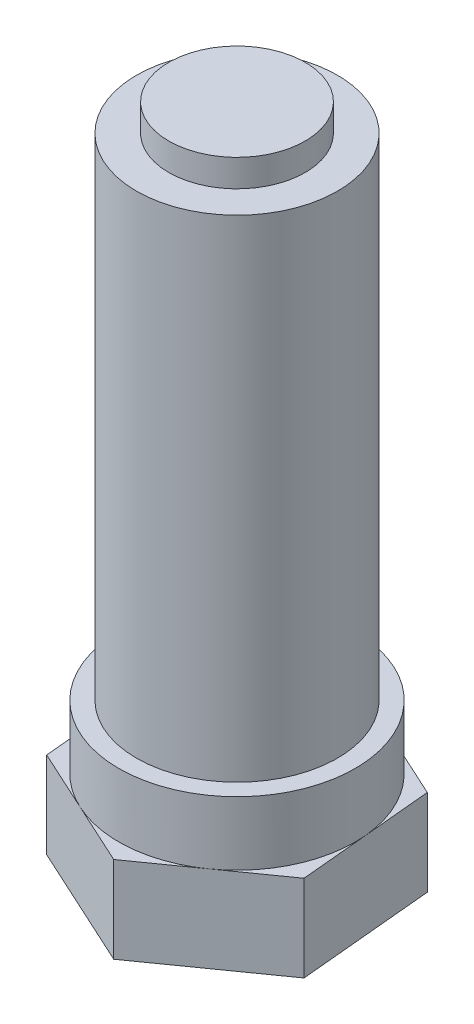
ISO-10303-21;
HEADER;
FILE_DESCRIPTION(('STEP AP214'),'2;1');
FILE_NAME('part.step','',(''),(''),'','','');
FILE_SCHEMA(('AUTOMOTIVE_DESIGN { 1 0 10303 214 1 1 1 1 }'));
ENDSEC;
DATA;
#1=APPLICATION_CONTEXT('core data for automotive mechanical design processes');
#2=APPLICATION_PROTOCOL_DEFINITION('international standard','automotive_design',2000,#1);
#3=PRODUCT_CONTEXT('',#1,'mechanical');
#4=PRODUCT('Part','Part','',(#3));
#5=PRODUCT_RELATED_PRODUCT_CATEGORY('part','',(#4));
#6=PRODUCT_DEFINITION_FORMATION('','',#4);
#7=PRODUCT_DEFINITION_CONTEXT('part definition',#1,'design');
#8=PRODUCT_DEFINITION('design','',#6,#7);
#9=PRODUCT_DEFINITION_SHAPE('','',#8);
#10=(LENGTH_UNIT() NAMED_UNIT(*) SI_UNIT(.MILLI.,.METRE.));
#11=(NAMED_UNIT(*) PLANE_ANGLE_UNIT() SI_UNIT($,.RADIAN.));
#12=(NAMED_UNIT(*) SI_UNIT($,.STERADIAN.) SOLID_ANGLE_UNIT());
#13=UNCERTAINTY_MEASURE_WITH_UNIT(LENGTH_MEASURE(1.E-05),#10,'distance_accuracy_value','');
#14=(GEOMETRIC_REPRESENTATION_CONTEXT(3) GLOBAL_UNCERTAINTY_ASSIGNED_CONTEXT((#13)) GLOBAL_UNIT_ASSIGNED_CONTEXT((#10,
#11,#12)) REPRESENTATION_CONTEXT('',''));
#15=CARTESIAN_POINT('',(0.,0.,0.));
#16=DIRECTION('',(0.,0.,1.));
#17=DIRECTION('',(1.,0.,0.));
#18=AXIS2_PLACEMENT_3D('',#15,#16,#17);
#19=CARTESIAN_POINT('',(0.,9.5,0.));
#20=DIRECTION('',(0.,1.,0.));
#21=DIRECTION('',(0.,0.,1.));
#22=AXIS2_PLACEMENT_3D('',#19,#20,#21);
#23=PLANE('',#22);
#24=CARTESIAN_POINT('',(0.,9.5,0.));
#25=DIRECTION('',(0.,1.,0.));
#26=DIRECTION('',(0.,0.,1.));
#27=AXIS2_PLACEMENT_3D('',#24,#25,#26);
#28=CIRCLE('',#27,13.);
#29=CARTESIAN_POINT('',(7.51506732107869,9.5,10.6077218647387));
#30=VERTEX_POINT('',#29);
#31=CARTESIAN_POINT('',(12.9440902716827,9.5,-1.20437827883507));
#32=VERTEX_POINT('',#31);
#33=EDGE_CURVE('E134',#30,#32,#28,.T.);
#34=ORIENTED_EDGE('',*,*,#33,.F.);
#35=DIRECTION('',(0.815978604979899,0.,-0.578082101621438));
#36=VECTOR('',#35,1.);
#37=CARTESIAN_POINT('',(1.39069624698313,9.5,14.9465480055416));
#38=LINE('',#37,#36);
#39=CARTESIAN_POINT('',(13.6394383951743,9.5,6.26889572393574));
#40=VERTEX_POINT('',#39);
#41=EDGE_CURVE('E123',#30,#40,#38,.T.);
#42=ORIENTED_EDGE('',*,*,#41,.T.);
#43=DIRECTION('',(-0.0926444829873134,0.,-0.995699251667899));
#44=VECTOR('',#43,1.);
#45=CARTESIAN_POINT('',(13.6394383951743,9.5,6.26889572393574));
#46=LINE('',#45,#44);
#47=EDGE_CURVE('E135',#40,#32,#46,.T.);
#48=ORIENTED_EDGE('',*,*,#47,.T.);
#49=EDGE_LOOP('',(#34,#42,#48));
#50=FACE_BOUND('',#49,.T.);
#51=ADVANCED_FACE('F43',(#50),#23,.T.);
#52=CARTESIAN_POINT('',(5.42902295060399,9.5,-11.8121001435738));
#53=VERTEX_POINT('',#52);
#54=EDGE_CURVE('E141',#32,#53,#28,.T.);
#55=ORIENTED_EDGE('',*,*,#54,.F.);
#56=CARTESIAN_POINT('',(12.2487421481911,9.5,-8.67765228160589));
#57=VERTEX_POINT('',#56);
#58=EDGE_CURVE('E122',#32,#57,#46,.T.);
#59=ORIENTED_EDGE('',*,*,#58,.T.);
#60=DIRECTION('',(-0.908623087967212,0.,-0.417617150046461));
#61=VECTOR('',#60,1.);
#62=CARTESIAN_POINT('',(12.2487421481911,9.5,-8.67765228160589));
#63=LINE('',#62,#61);
#64=EDGE_CURVE('E151',#57,#53,#63,.T.);
#65=ORIENTED_EDGE('',*,*,#64,.T.);
#66=EDGE_LOOP('',(#55,#59,#65));
#67=FACE_BOUND('',#66,.T.);
#68=ADVANCED_FACE('F248',(#67),#23,.T.);
#69=CARTESIAN_POINT('',(-7.51506732107869,9.5,-10.6077218647387));
#70=VERTEX_POINT('',#69);
#71=EDGE_CURVE('E213',#53,#70,#28,.T.);
#72=ORIENTED_EDGE('',*,*,#71,.F.);
#73=CARTESIAN_POINT('',(-1.39069624698313,9.5,-14.9465480055416));
#74=VERTEX_POINT('',#73);
#75=EDGE_CURVE('E150',#53,#74,#63,.T.);
#76=ORIENTED_EDGE('',*,*,#75,.T.);
#77=DIRECTION('',(-0.815978604979899,0.,0.578082101621438));
#78=VECTOR('',#77,1.);
#79=CARTESIAN_POINT('',(-1.39069624698313,9.5,-14.9465480055416));
#80=LINE('',#79,#78);
#81=EDGE_CURVE('E155',#74,#70,#80,.T.);
#82=ORIENTED_EDGE('',*,*,#81,.T.);
#83=EDGE_LOOP('',(#72,#76,#82));
#84=FACE_BOUND('',#83,.T.);
#85=ADVANCED_FACE('F254',(#84),#23,.T.);
#86=CARTESIAN_POINT('',(-12.9440902716827,9.5,1.20437827883507));
#87=VERTEX_POINT('',#86);
#88=EDGE_CURVE('E144',#70,#87,#28,.T.);
#89=ORIENTED_EDGE('',*,*,#88,.F.);
#90=CARTESIAN_POINT('',(-13.6394383951743,9.5,-6.26889572393574));
#91=VERTEX_POINT('',#90);
#92=EDGE_CURVE('E154',#70,#91,#80,.T.);
#93=ORIENTED_EDGE('',*,*,#92,.T.);
#94=DIRECTION('',(0.0926444829873133,0.,0.995699251667899));
#95=VECTOR('',#94,1.);
#96=CARTESIAN_POINT('',(-13.6394383951743,9.5,-6.26889572393574));
#97=LINE('',#96,#95);
#98=EDGE_CURVE('E159',#91,#87,#97,.T.);
#99=ORIENTED_EDGE('',*,*,#98,.T.);
#100=EDGE_LOOP('',(#89,#93,#99));
#101=FACE_BOUND('',#100,.T.);
#102=ADVANCED_FACE('F211',(#101),#23,.T.);
#103=CARTESIAN_POINT('',(-5.42902295060399,9.5,11.8121001435738));
#104=VERTEX_POINT('',#103);
#105=EDGE_CURVE('E68',#87,#104,#28,.T.);
#106=ORIENTED_EDGE('',*,*,#105,.F.);
#107=CARTESIAN_POINT('',(-12.2487421481911,9.5,8.67765228160589));
#108=VERTEX_POINT('',#107);
#109=EDGE_CURVE('E158',#87,#108,#97,.T.);
#110=ORIENTED_EDGE('',*,*,#109,.T.);
#111=DIRECTION('',(0.908623087967212,0.,0.417617150046461));
#112=VECTOR('',#111,1.);
#113=CARTESIAN_POINT('',(-12.2487421481911,9.5,8.67765228160589));
#114=LINE('',#113,#112);
#115=EDGE_CURVE('E162',#108,#104,#114,.T.);
#116=ORIENTED_EDGE('',*,*,#115,.T.);
#117=EDGE_LOOP('',(#106,#110,#116));
#118=FACE_BOUND('',#117,.T.);
#119=ADVANCED_FACE('F260',(#118),#23,.T.);
#120=CARTESIAN_POINT('',(1.39069624698313,9.5,14.9465480055416));
#121=DIRECTION('',(-0.578082101621438,0.,-0.815978604979899));
#122=DIRECTION('',(-0.815978604979899,0.,0.578082101621438));
#123=AXIS2_PLACEMENT_3D('',#120,#121,#122);
#124=PLANE('',#123);
#125=DIRECTION('',(0.815978604979899,0.,-0.578082101621438));
#126=VECTOR('',#125,1.);
#127=CARTESIAN_POINT('',(1.39069624698313,0.,14.9465480055416));
#128=LINE('',#127,#126);
#129=CARTESIAN_POINT('',(1.39069624698313,0.,14.9465480055416));
#130=VERTEX_POINT('',#129);
#131=CARTESIAN_POINT('',(13.6394383951743,0.,6.26889572393574));
#132=VERTEX_POINT('',#131);
#133=EDGE_CURVE('E165',#130,#132,#128,.T.);
#134=ORIENTED_EDGE('',*,*,#133,.T.);
#135=DIRECTION('',(0.,-1.,0.));
#136=VECTOR('',#135,1.);
#137=CARTESIAN_POINT('',(13.6394383951743,9.5,6.26889572393574));
#138=LINE('',#137,#136);
#139=EDGE_CURVE('E47',#40,#132,#138,.T.);
#140=ORIENTED_EDGE('',*,*,#139,.F.);
#141=ORIENTED_EDGE('',*,*,#41,.F.);
#142=CARTESIAN_POINT('',(1.39069624698313,9.5,14.9465480055416));
#143=VERTEX_POINT('',#142);
#144=EDGE_CURVE('E115',#143,#30,#38,.T.);
#145=ORIENTED_EDGE('',*,*,#144,.F.);
#146=DIRECTION('',(0.,-1.,0.));
#147=VECTOR('',#146,1.);
#148=CARTESIAN_POINT('',(1.39069624698313,9.5,14.9465480055416));
#149=LINE('',#148,#147);
#150=EDGE_CURVE('E164',#143,#130,#149,.T.);
#151=ORIENTED_EDGE('',*,*,#150,.T.);
#152=EDGE_LOOP('',(#134,#140,#141,#145,#151));
#153=FACE_BOUND('',#152,.T.);
#154=ADVANCED_FACE('F45',(#153),#124,.F.);
#155=CARTESIAN_POINT('',(13.6394383951743,9.5,6.26889572393574));
#156=DIRECTION('',(-0.995699251667899,0.,0.0926444829873133));
#157=DIRECTION('',(0.0926444829873133,0.,0.995699251667899));
#158=AXIS2_PLACEMENT_3D('',#155,#156,#157);
#159=PLANE('',#158);
#160=DIRECTION('',(-0.0926444829873134,0.,-0.995699251667899));
#161=VECTOR('',#160,1.);
#162=CARTESIAN_POINT('',(13.6394383951743,0.,6.26889572393574));
#163=LINE('',#162,#161);
#164=CARTESIAN_POINT('',(12.2487421481911,0.,-8.67765228160589));
#165=VERTEX_POINT('',#164);
#166=EDGE_CURVE('E167',#132,#165,#163,.T.);
#167=ORIENTED_EDGE('',*,*,#166,.T.);
#168=DIRECTION('',(0.,-1.,0.));
#169=VECTOR('',#168,1.);
#170=CARTESIAN_POINT('',(12.2487421481911,9.5,-8.67765228160589));
#171=LINE('',#170,#169);
#172=EDGE_CURVE('E145',#57,#165,#171,.T.);
#173=ORIENTED_EDGE('',*,*,#172,.F.);
#174=ORIENTED_EDGE('',*,*,#58,.F.);
#175=ORIENTED_EDGE('',*,*,#47,.F.);
#176=ORIENTED_EDGE('',*,*,#139,.T.);
#177=EDGE_LOOP('',(#167,#173,#174,#175,#176));
#178=FACE_BOUND('',#177,.T.);
#179=ADVANCED_FACE('F272',(#178),#159,.F.);
#180=CARTESIAN_POINT('',(12.2487421481911,9.5,-8.67765228160589));
#181=DIRECTION('',(-0.417617150046461,0.,0.908623087967212));
#182=DIRECTION('',(0.908623087967212,0.,0.417617150046461));
#183=AXIS2_PLACEMENT_3D('',#180,#181,#182);
#184=PLANE('',#183);
#185=DIRECTION('',(-0.908623087967212,0.,-0.417617150046461));
#186=VECTOR('',#185,1.);
#187=CARTESIAN_POINT('',(12.2487421481911,0.,-8.67765228160589));
#188=LINE('',#187,#186);
#189=CARTESIAN_POINT('',(-1.39069624698313,0.,-14.9465480055416));
#190=VERTEX_POINT('',#189);
#191=EDGE_CURVE('E169',#165,#190,#188,.T.);
#192=ORIENTED_EDGE('',*,*,#191,.T.);
#193=DIRECTION('',(0.,-1.,0.));
#194=VECTOR('',#193,1.);
#195=CARTESIAN_POINT('',(-1.39069624698313,9.5,-14.9465480055416));
#196=LINE('',#195,#194);
#197=EDGE_CURVE('E183',#74,#190,#196,.T.);
#198=ORIENTED_EDGE('',*,*,#197,.F.);
#199=ORIENTED_EDGE('',*,*,#75,.F.);
#200=ORIENTED_EDGE('',*,*,#64,.F.);
#201=ORIENTED_EDGE('',*,*,#172,.T.);
#202=EDGE_LOOP('',(#192,#198,#199,#200,#201));
#203=FACE_BOUND('',#202,.T.);
#204=ADVANCED_FACE('F190',(#203),#184,.F.);
#205=CARTESIAN_POINT('',(-1.39069624698313,9.5,-14.9465480055416));
#206=DIRECTION('',(0.578082101621438,0.,0.815978604979899));
#207=DIRECTION('',(0.815978604979899,0.,-0.578082101621438));
#208=AXIS2_PLACEMENT_3D('',#205,#206,#207);
#209=PLANE('',#208);
#210=DIRECTION('',(-0.815978604979899,0.,0.578082101621438));
#211=VECTOR('',#210,1.);
#212=CARTESIAN_POINT('',(-1.39069624698313,0.,-14.9465480055416));
#213=LINE('',#212,#211);
#214=CARTESIAN_POINT('',(-13.6394383951743,0.,-6.26889572393574));
#215=VERTEX_POINT('',#214);
#216=EDGE_CURVE('E171',#190,#215,#213,.T.);
#217=ORIENTED_EDGE('',*,*,#216,.T.);
#218=DIRECTION('',(0.,-1.,0.));
#219=VECTOR('',#218,1.);
#220=CARTESIAN_POINT('',(-13.6394383951743,9.5,-6.26889572393574));
#221=LINE('',#220,#219);
#222=EDGE_CURVE('E180',#91,#215,#221,.T.);
#223=ORIENTED_EDGE('',*,*,#222,.F.);
#224=ORIENTED_EDGE('',*,*,#92,.F.);
#225=ORIENTED_EDGE('',*,*,#81,.F.);
#226=ORIENTED_EDGE('',*,*,#197,.T.);
#227=EDGE_LOOP('',(#217,#223,#224,#225,#226));
#228=FACE_BOUND('',#227,.T.);
#229=ADVANCED_FACE('F203',(#228),#209,.F.);
#230=CARTESIAN_POINT('',(-13.6394383951743,9.5,-6.26889572393574));
#231=DIRECTION('',(0.995699251667899,0.,-0.0926444829873132));
#232=DIRECTION('',(-0.0926444829873132,0.,-0.995699251667899));
#233=AXIS2_PLACEMENT_3D('',#230,#231,#232);
#234=PLANE('',#233);
#235=DIRECTION('',(0.0926444829873133,0.,0.995699251667899));
#236=VECTOR('',#235,1.);
#237=CARTESIAN_POINT('',(-13.6394383951743,0.,-6.26889572393574));
#238=LINE('',#237,#236);
#239=CARTESIAN_POINT('',(-12.2487421481911,0.,8.67765228160589));
#240=VERTEX_POINT('',#239);
#241=EDGE_CURVE('E173',#215,#240,#238,.T.);
#242=ORIENTED_EDGE('',*,*,#241,.T.);
#243=DIRECTION('',(0.,-1.,0.));
#244=VECTOR('',#243,1.);
#245=CARTESIAN_POINT('',(-12.2487421481911,9.5,8.67765228160589));
#246=LINE('',#245,#244);
#247=EDGE_CURVE('E177',#108,#240,#246,.T.);
#248=ORIENTED_EDGE('',*,*,#247,.F.);
#249=ORIENTED_EDGE('',*,*,#109,.F.);
#250=ORIENTED_EDGE('',*,*,#98,.F.);
#251=ORIENTED_EDGE('',*,*,#222,.T.);
#252=EDGE_LOOP('',(#242,#248,#249,#250,#251));
#253=FACE_BOUND('',#252,.T.);
#254=ADVANCED_FACE('F208',(#253),#234,.F.);
#255=CARTESIAN_POINT('',(-12.2487421481911,9.5,8.67765228160589));
#256=DIRECTION('',(0.417617150046461,0.,-0.908623087967212));
#257=DIRECTION('',(-0.908623087967212,0.,-0.417617150046461));
#258=AXIS2_PLACEMENT_3D('',#255,#256,#257);
#259=PLANE('',#258);
#260=DIRECTION('',(0.908623087967212,0.,0.417617150046461));
#261=VECTOR('',#260,1.);
#262=CARTESIAN_POINT('',(-12.2487421481911,0.,8.67765228160589));
#263=LINE('',#262,#261);
#264=EDGE_CURVE('E132',#240,#130,#263,.T.);
#265=ORIENTED_EDGE('',*,*,#264,.T.);
#266=ORIENTED_EDGE('',*,*,#150,.F.);
#267=EDGE_CURVE('E118',#104,#143,#114,.T.);
#268=ORIENTED_EDGE('',*,*,#267,.F.);
#269=ORIENTED_EDGE('',*,*,#115,.F.);
#270=ORIENTED_EDGE('',*,*,#247,.T.);
#271=EDGE_LOOP('',(#265,#266,#268,#269,#270));
#272=FACE_BOUND('',#271,.T.);
#273=ADVANCED_FACE('F259',(#272),#259,.F.);
#274=EDGE_CURVE('E60',#104,#30,#28,.T.);
#275=ORIENTED_EDGE('',*,*,#274,.F.);
#276=ORIENTED_EDGE('',*,*,#267,.T.);
#277=ORIENTED_EDGE('',*,*,#144,.T.);
#278=EDGE_LOOP('',(#275,#276,#277));
#279=FACE_BOUND('',#278,.T.);
#280=ADVANCED_FACE('F117',(#279),#23,.T.);
#281=CARTESIAN_POINT('',(0.,0.,0.));
#282=DIRECTION('',(0.,1.,0.));
#283=DIRECTION('',(0.,0.,1.));
#284=AXIS2_PLACEMENT_3D('',#281,#282,#283);
#285=PLANE('',#284);
#286=ORIENTED_EDGE('',*,*,#133,.F.);
#287=ORIENTED_EDGE('',*,*,#264,.F.);
#288=ORIENTED_EDGE('',*,*,#241,.F.);
#289=ORIENTED_EDGE('',*,*,#216,.F.);
#290=ORIENTED_EDGE('',*,*,#191,.F.);
#291=ORIENTED_EDGE('',*,*,#166,.F.);
#292=EDGE_LOOP('',(#286,#287,#288,#289,#290,#291));
#293=FACE_BOUND('',#292,.T.);
#294=ADVANCED_FACE('F198',(#293),#285,.F.);
#295=CARTESIAN_POINT('',(0.,16.5,0.));
#296=DIRECTION('',(0.,-1.,0.));
#297=DIRECTION('',(0.,0.,-1.));
#298=AXIS2_PLACEMENT_3D('',#295,#296,#297);
#299=CYLINDRICAL_SURFACE('',#298,13.);
#300=CARTESIAN_POINT('',(0.,16.5,0.));
#301=DIRECTION('',(0.,1.,0.));
#302=DIRECTION('',(0.,0.,1.));
#303=AXIS2_PLACEMENT_3D('',#300,#301,#302);
#304=CIRCLE('',#303,13.);
#305=CARTESIAN_POINT('',(0.,16.5,13.));
#306=VERTEX_POINT('',#305);
#307=EDGE_CURVE('E138',#306,#306,#304,.T.);
#308=ORIENTED_EDGE('',*,*,#307,.F.);
#309=EDGE_LOOP('',(#308));
#310=FACE_BOUND('',#309,.T.);
#311=ORIENTED_EDGE('',*,*,#33,.T.);
#312=ORIENTED_EDGE('',*,*,#54,.T.);
#313=ORIENTED_EDGE('',*,*,#71,.T.);
#314=ORIENTED_EDGE('',*,*,#88,.T.);
#315=ORIENTED_EDGE('',*,*,#105,.T.);
#316=ORIENTED_EDGE('',*,*,#274,.T.);
#317=EDGE_LOOP('',(#311,#312,#313,#314,#315,#316));
#318=FACE_BOUND('',#317,.T.);
#319=ADVANCED_FACE('F142',(#310,#318),#299,.T.);
#320=CARTESIAN_POINT('',(0.,16.5,0.));
#321=DIRECTION('',(0.,1.,0.));
#322=DIRECTION('',(0.,0.,1.));
#323=AXIS2_PLACEMENT_3D('',#320,#321,#322);
#324=PLANE('',#323);
#325=CARTESIAN_POINT('',(0.,16.5,0.));
#326=DIRECTION('',(0.,1.,0.));
#327=DIRECTION('',(0.,0.,1.));
#328=AXIS2_PLACEMENT_3D('',#325,#326,#327);
#329=CIRCLE('',#328,11.05);
#330=CARTESIAN_POINT('',(0.,16.5,11.05));
#331=VERTEX_POINT('',#330);
#332=EDGE_CURVE('E52',#331,#331,#329,.T.);
#333=ORIENTED_EDGE('',*,*,#332,.F.);
#334=EDGE_LOOP('',(#333));
#335=FACE_BOUND('',#334,.T.);
#336=ORIENTED_EDGE('',*,*,#307,.T.);
#337=EDGE_LOOP('',(#336));
#338=FACE_BOUND('',#337,.T.);
#339=ADVANCED_FACE('F240',(#335,#338),#324,.T.);
#340=CARTESIAN_POINT('',(0.,70.5,0.));
#341=DIRECTION('',(0.,-1.,0.));
#342=DIRECTION('',(0.,0.,-1.));
#343=AXIS2_PLACEMENT_3D('',#340,#341,#342);
#344=CYLINDRICAL_SURFACE('',#343,11.05);
#345=CARTESIAN_POINT('',(0.,70.5,0.));
#346=DIRECTION('',(0.,1.,0.));
#347=DIRECTION('',(0.,0.,1.));
#348=AXIS2_PLACEMENT_3D('',#345,#346,#347);
#349=CIRCLE('',#348,11.05);
#350=CARTESIAN_POINT('',(0.,70.5,11.05));
#351=VERTEX_POINT('',#350);
#352=EDGE_CURVE('E139',#351,#351,#349,.T.);
#353=ORIENTED_EDGE('',*,*,#352,.F.);
#354=EDGE_LOOP('',(#353));
#355=FACE_BOUND('',#354,.T.);
#356=ORIENTED_EDGE('',*,*,#332,.T.);
#357=EDGE_LOOP('',(#356));
#358=FACE_BOUND('',#357,.T.);
#359=ADVANCED_FACE('F235',(#355,#358),#344,.T.);
#360=CARTESIAN_POINT('',(0.,70.5,0.));
#361=DIRECTION('',(0.,1.,0.));
#362=DIRECTION('',(0.,0.,1.));
#363=AXIS2_PLACEMENT_3D('',#360,#361,#362);
#364=PLANE('',#363);
#365=CARTESIAN_POINT('',(0.,70.5,0.));
#366=DIRECTION('',(0.,1.,0.));
#367=DIRECTION('',(0.,0.,1.));
#368=AXIS2_PLACEMENT_3D('',#365,#366,#367);
#369=CIRCLE('',#368,7.5);
#370=CARTESIAN_POINT('',(0.,70.5,7.5));
#371=VERTEX_POINT('',#370);
#372=EDGE_CURVE('E11',#371,#371,#369,.T.);
#373=ORIENTED_EDGE('',*,*,#372,.F.);
#374=EDGE_LOOP('',(#373));
#375=FACE_BOUND('',#374,.T.);
#376=ORIENTED_EDGE('',*,*,#352,.T.);
#377=EDGE_LOOP('',(#376));
#378=FACE_BOUND('',#377,.T.);
#379=ADVANCED_FACE('F229',(#375,#378),#364,.T.);
#380=CARTESIAN_POINT('',(0.,73.5,0.));
#381=DIRECTION('',(0.,-1.,0.));
#382=DIRECTION('',(0.,0.,-1.));
#383=AXIS2_PLACEMENT_3D('',#380,#381,#382);
#384=CYLINDRICAL_SURFACE('',#383,7.5);
#385=CARTESIAN_POINT('',(0.,73.5,0.));
#386=DIRECTION('',(0.,1.,0.));
#387=DIRECTION('',(0.,0.,1.));
#388=AXIS2_PLACEMENT_3D('',#385,#386,#387);
#389=CIRCLE('',#388,7.5);
#390=CARTESIAN_POINT('',(0.,73.5,7.5));
#391=VERTEX_POINT('',#390);
#392=EDGE_CURVE('E219',#391,#391,#389,.T.);
#393=ORIENTED_EDGE('',*,*,#392,.F.);
#394=EDGE_LOOP('',(#393));
#395=FACE_BOUND('',#394,.T.);
#396=ORIENTED_EDGE('',*,*,#372,.T.);
#397=EDGE_LOOP('',(#396));
#398=FACE_BOUND('',#397,.T.);
#399=ADVANCED_FACE('F226',(#395,#398),#384,.T.);
#400=CARTESIAN_POINT('',(0.,73.5,0.));
#401=DIRECTION('',(0.,1.,0.));
#402=DIRECTION('',(0.,0.,1.));
#403=AXIS2_PLACEMENT_3D('',#400,#401,#402);
#404=PLANE('',#403);
#405=ORIENTED_EDGE('',*,*,#392,.T.);
#406=EDGE_LOOP('',(#405));
#407=FACE_BOUND('',#406,.T.);
#408=ADVANCED_FACE('F224',(#407),#404,.T.);
#409=CLOSED_SHELL('',(#51,#68,#85,#102,#119,#154,#179,#204,#229,#254,#273,#280,#294,#319,#339,
#359,#379,#399,#408));
#410=MANIFOLD_SOLID_BREP('B2',#409);
#411=ADVANCED_BREP_SHAPE_REPRESENTATION('',(#18,#410),#14);
#412=SHAPE_DEFINITION_REPRESENTATION(#9,#411);
ENDSEC;
END-ISO-10303-21;
